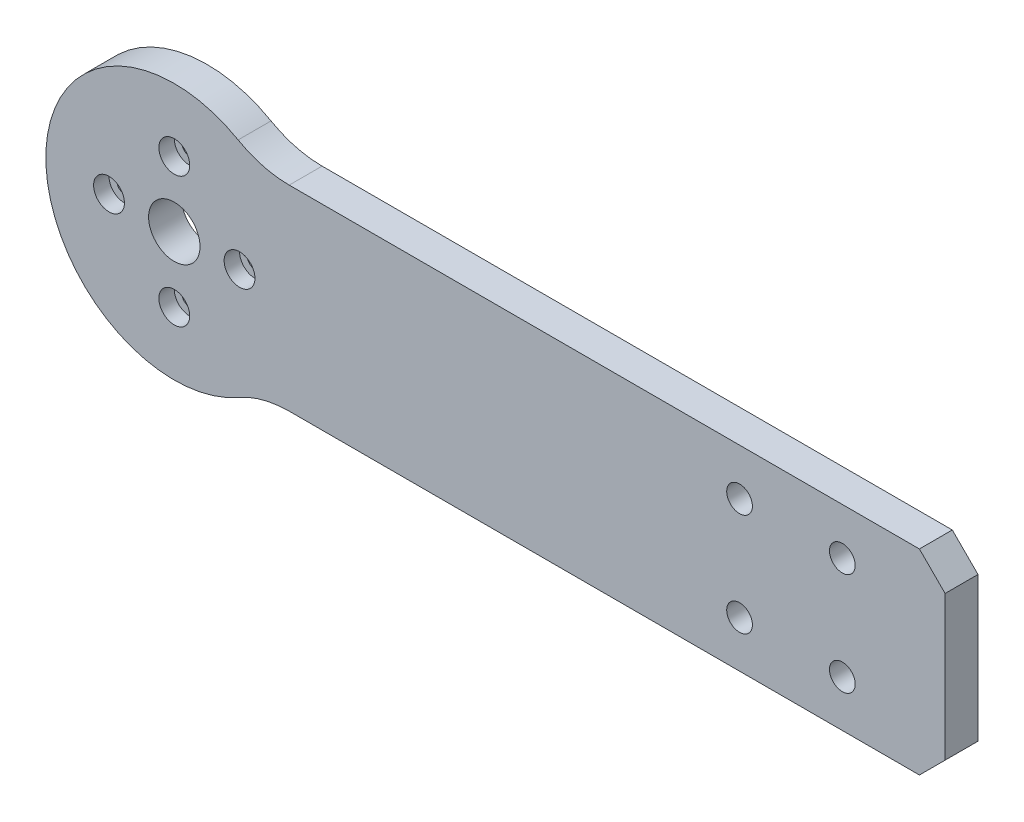
ISO-10303-21;
HEADER;
FILE_DESCRIPTION(('STEP AP214'),'2;1');
FILE_NAME('part.step','',(''),(''),'','','');
FILE_SCHEMA(('AUTOMOTIVE_DESIGN { 1 0 10303 214 1 1 1 1 }'));
ENDSEC;
DATA;
#1=APPLICATION_CONTEXT('core data for automotive mechanical design processes');
#2=APPLICATION_PROTOCOL_DEFINITION('international standard','automotive_design',2000,#1);
#3=PRODUCT_CONTEXT('',#1,'mechanical');
#4=PRODUCT('Part','Part','',(#3));
#5=PRODUCT_RELATED_PRODUCT_CATEGORY('part','',(#4));
#6=PRODUCT_DEFINITION_FORMATION('','',#4);
#7=PRODUCT_DEFINITION_CONTEXT('part definition',#1,'design');
#8=PRODUCT_DEFINITION('design','',#6,#7);
#9=PRODUCT_DEFINITION_SHAPE('','',#8);
#10=(LENGTH_UNIT() NAMED_UNIT(*) SI_UNIT(.MILLI.,.METRE.));
#11=(NAMED_UNIT(*) PLANE_ANGLE_UNIT() SI_UNIT($,.RADIAN.));
#12=(NAMED_UNIT(*) SI_UNIT($,.STERADIAN.) SOLID_ANGLE_UNIT());
#13=UNCERTAINTY_MEASURE_WITH_UNIT(LENGTH_MEASURE(1.E-05),#10,'distance_accuracy_value','');
#14=(GEOMETRIC_REPRESENTATION_CONTEXT(3) GLOBAL_UNCERTAINTY_ASSIGNED_CONTEXT((#13)) GLOBAL_UNIT_ASSIGNED_CONTEXT((#10,
#11,#12)) REPRESENTATION_CONTEXT('',''));
#15=CARTESIAN_POINT('',(0.,0.,0.));
#16=DIRECTION('',(0.,0.,1.));
#17=DIRECTION('',(1.,0.,0.));
#18=AXIS2_PLACEMENT_3D('',#15,#16,#17);
#19=CARTESIAN_POINT('',(0.,-12.7,6.4));
#20=DIRECTION('',(0.,0.,-1.));
#21=DIRECTION('',(-1.,0.,0.));
#22=AXIS2_PLACEMENT_3D('',#19,#20,#21);
#23=CYLINDRICAL_SURFACE('',#22,1.5);
#24=CARTESIAN_POINT('',(0.,-12.7,0.));
#25=DIRECTION('',(0.,0.,1.));
#26=DIRECTION('',(1.,0.,0.));
#27=AXIS2_PLACEMENT_3D('',#24,#25,#26);
#28=CIRCLE('',#27,1.5);
#29=CARTESIAN_POINT('',(1.5,-12.7,0.));
#30=VERTEX_POINT('',#29);
#31=EDGE_CURVE('E226',#30,#30,#28,.T.);
#32=ORIENTED_EDGE('',*,*,#31,.F.);
#33=EDGE_LOOP('',(#32));
#34=FACE_BOUND('',#33,.T.);
#35=CARTESIAN_POINT('',(0.,-12.7,3.4));
#36=DIRECTION('',(0.,0.,1.));
#37=DIRECTION('',(1.,0.,0.));
#38=AXIS2_PLACEMENT_3D('',#35,#36,#37);
#39=CIRCLE('',#38,1.5);
#40=CARTESIAN_POINT('',(1.5,-12.7,3.4));
#41=VERTEX_POINT('',#40);
#42=EDGE_CURVE('E166',#41,#41,#39,.T.);
#43=ORIENTED_EDGE('',*,*,#42,.T.);
#44=EDGE_LOOP('',(#43));
#45=FACE_BOUND('',#44,.T.);
#46=ADVANCED_FACE('F38',(#34,#45),#23,.F.);
#47=CARTESIAN_POINT('',(12.7,0.,6.4));
#48=DIRECTION('',(0.,0.,-1.));
#49=DIRECTION('',(-1.,0.,0.));
#50=AXIS2_PLACEMENT_3D('',#47,#48,#49);
#51=CYLINDRICAL_SURFACE('',#50,1.5);
#52=CARTESIAN_POINT('',(12.7,0.,0.));
#53=DIRECTION('',(0.,0.,1.));
#54=DIRECTION('',(1.,0.,0.));
#55=AXIS2_PLACEMENT_3D('',#52,#53,#54);
#56=CIRCLE('',#55,1.5);
#57=CARTESIAN_POINT('',(14.2,0.,0.));
#58=VERTEX_POINT('',#57);
#59=EDGE_CURVE('E209',#58,#58,#56,.T.);
#60=ORIENTED_EDGE('',*,*,#59,.F.);
#61=EDGE_LOOP('',(#60));
#62=FACE_BOUND('',#61,.T.);
#63=CARTESIAN_POINT('',(12.7,0.,3.4));
#64=DIRECTION('',(0.,0.,1.));
#65=DIRECTION('',(1.,0.,0.));
#66=AXIS2_PLACEMENT_3D('',#63,#64,#65);
#67=CIRCLE('',#66,1.5);
#68=CARTESIAN_POINT('',(14.2,0.,3.4));
#69=VERTEX_POINT('',#68);
#70=EDGE_CURVE('E162',#69,#69,#67,.T.);
#71=ORIENTED_EDGE('',*,*,#70,.T.);
#72=EDGE_LOOP('',(#71));
#73=FACE_BOUND('',#72,.T.);
#74=ADVANCED_FACE('F327',(#62,#73),#51,.F.);
#75=CARTESIAN_POINT('',(0.,12.7,6.4));
#76=DIRECTION('',(0.,0.,-1.));
#77=DIRECTION('',(-1.,0.,0.));
#78=AXIS2_PLACEMENT_3D('',#75,#76,#77);
#79=CYLINDRICAL_SURFACE('',#78,1.5);
#80=CARTESIAN_POINT('',(0.,12.7,0.));
#81=DIRECTION('',(0.,0.,1.));
#82=DIRECTION('',(1.,0.,0.));
#83=AXIS2_PLACEMENT_3D('',#80,#81,#82);
#84=CIRCLE('',#83,1.5);
#85=CARTESIAN_POINT('',(1.5,12.7,0.));
#86=VERTEX_POINT('',#85);
#87=EDGE_CURVE('E207',#86,#86,#84,.T.);
#88=ORIENTED_EDGE('',*,*,#87,.F.);
#89=EDGE_LOOP('',(#88));
#90=FACE_BOUND('',#89,.T.);
#91=CARTESIAN_POINT('',(0.,12.7,3.4));
#92=DIRECTION('',(0.,0.,1.));
#93=DIRECTION('',(1.,0.,0.));
#94=AXIS2_PLACEMENT_3D('',#91,#92,#93);
#95=CIRCLE('',#94,1.5);
#96=CARTESIAN_POINT('',(1.5,12.7,3.4));
#97=VERTEX_POINT('',#96);
#98=EDGE_CURVE('E157',#97,#97,#95,.T.);
#99=ORIENTED_EDGE('',*,*,#98,.T.);
#100=EDGE_LOOP('',(#99));
#101=FACE_BOUND('',#100,.T.);
#102=ADVANCED_FACE('F333',(#90,#101),#79,.F.);
#103=CARTESIAN_POINT('',(-12.7,0.,6.4));
#104=DIRECTION('',(0.,0.,-1.));
#105=DIRECTION('',(-1.,0.,0.));
#106=AXIS2_PLACEMENT_3D('',#103,#104,#105);
#107=CYLINDRICAL_SURFACE('',#106,1.5);
#108=CARTESIAN_POINT('',(-12.7,0.,0.));
#109=DIRECTION('',(0.,0.,1.));
#110=DIRECTION('',(1.,0.,0.));
#111=AXIS2_PLACEMENT_3D('',#108,#109,#110);
#112=CIRCLE('',#111,1.5);
#113=CARTESIAN_POINT('',(-11.2,0.,0.));
#114=VERTEX_POINT('',#113);
#115=EDGE_CURVE('E170',#114,#114,#112,.T.);
#116=ORIENTED_EDGE('',*,*,#115,.F.);
#117=EDGE_LOOP('',(#116));
#118=FACE_BOUND('',#117,.T.);
#119=CARTESIAN_POINT('',(-12.7,0.,3.4));
#120=DIRECTION('',(0.,0.,1.));
#121=DIRECTION('',(1.,0.,0.));
#122=AXIS2_PLACEMENT_3D('',#119,#120,#121);
#123=CIRCLE('',#122,1.5);
#124=CARTESIAN_POINT('',(-11.2,0.,3.4));
#125=VERTEX_POINT('',#124);
#126=EDGE_CURVE('E153',#125,#125,#123,.T.);
#127=ORIENTED_EDGE('',*,*,#126,.T.);
#128=EDGE_LOOP('',(#127));
#129=FACE_BOUND('',#128,.T.);
#130=ADVANCED_FACE('F363',(#118,#129),#107,.F.);
#131=CARTESIAN_POINT('',(0.,0.,6.4));
#132=DIRECTION('',(0.,0.,1.));
#133=DIRECTION('',(1.,0.,0.));
#134=AXIS2_PLACEMENT_3D('',#131,#132,#133);
#135=PLANE('',#134);
#136=CARTESIAN_POINT('',(0.,12.7,6.4));
#137=DIRECTION('',(0.,0.,1.));
#138=DIRECTION('',(1.,0.,0.));
#139=AXIS2_PLACEMENT_3D('',#136,#137,#138);
#140=CIRCLE('',#139,3.);
#141=CARTESIAN_POINT('',(3.,12.7,6.4));
#142=VERTEX_POINT('',#141);
#143=EDGE_CURVE('E217',#142,#142,#140,.T.);
#144=ORIENTED_EDGE('',*,*,#143,.F.);
#145=EDGE_LOOP('',(#144));
#146=FACE_BOUND('',#145,.T.);
#147=CARTESIAN_POINT('',(12.7000000000001,0.,6.4));
#148=DIRECTION('',(0.,0.,1.));
#149=DIRECTION('',(1.,0.,0.));
#150=AXIS2_PLACEMENT_3D('',#147,#148,#149);
#151=CIRCLE('',#150,2.99999999999993);
#152=CARTESIAN_POINT('',(15.7,0.,6.4));
#153=VERTEX_POINT('',#152);
#154=EDGE_CURVE('E218',#153,#153,#151,.T.);
#155=ORIENTED_EDGE('',*,*,#154,.F.);
#156=EDGE_LOOP('',(#155));
#157=FACE_BOUND('',#156,.T.);
#158=CARTESIAN_POINT('',(0.,-12.7000000000002,6.4));
#159=DIRECTION('',(0.,0.,1.));
#160=DIRECTION('',(1.,0.,0.));
#161=AXIS2_PLACEMENT_3D('',#158,#159,#160);
#162=CIRCLE('',#161,3.00000000000003);
#163=CARTESIAN_POINT('',(3.00000000000004,-12.7000000000002,6.4));
#164=VERTEX_POINT('',#163);
#165=EDGE_CURVE('E252',#164,#164,#162,.T.);
#166=ORIENTED_EDGE('',*,*,#165,.F.);
#167=EDGE_LOOP('',(#166));
#168=FACE_BOUND('',#167,.T.);
#169=CARTESIAN_POINT('',(-12.7000000000001,0.,6.4));
#170=DIRECTION('',(0.,0.,1.));
#171=DIRECTION('',(1.,0.,0.));
#172=AXIS2_PLACEMENT_3D('',#169,#170,#171);
#173=CIRCLE('',#172,3.00000000000019);
#174=CARTESIAN_POINT('',(-9.6999999999999,0.,6.4));
#175=VERTEX_POINT('',#174);
#176=EDGE_CURVE('E278',#175,#175,#173,.T.);
#177=ORIENTED_EDGE('',*,*,#176,.F.);
#178=EDGE_LOOP('',(#177));
#179=FACE_BOUND('',#178,.T.);
#180=CARTESIAN_POINT('',(110.,-10.,6.4));
#181=DIRECTION('',(0.,0.,1.));
#182=DIRECTION('',(1.,0.,0.));
#183=AXIS2_PLACEMENT_3D('',#180,#181,#182);
#184=CIRCLE('',#183,2.49999999999999);
#185=CARTESIAN_POINT('',(112.5,-10.,6.4));
#186=VERTEX_POINT('',#185);
#187=EDGE_CURVE('E222',#186,#186,#184,.T.);
#188=ORIENTED_EDGE('',*,*,#187,.F.);
#189=EDGE_LOOP('',(#188));
#190=FACE_BOUND('',#189,.T.);
#191=CARTESIAN_POINT('',(130.,10.,6.4));
#192=DIRECTION('',(0.,0.,1.));
#193=DIRECTION('',(1.,0.,0.));
#194=AXIS2_PLACEMENT_3D('',#191,#192,#193);
#195=CIRCLE('',#194,2.5);
#196=CARTESIAN_POINT('',(132.5,10.,6.4));
#197=VERTEX_POINT('',#196);
#198=EDGE_CURVE('E256',#197,#197,#195,.T.);
#199=ORIENTED_EDGE('',*,*,#198,.F.);
#200=EDGE_LOOP('',(#199));
#201=FACE_BOUND('',#200,.T.);
#202=CARTESIAN_POINT('',(0.,0.,6.4));
#203=DIRECTION('',(0.,0.,1.));
#204=DIRECTION('',(1.,0.,0.));
#205=AXIS2_PLACEMENT_3D('',#202,#203,#204);
#206=CIRCLE('',#205,25.);
#207=CARTESIAN_POINT('',(12.4238110194462,21.6944444444445,6.4));
#208=VERTEX_POINT('',#207);
#209=CARTESIAN_POINT('',(12.4238110194462,-21.6944444444445,6.4));
#210=VERTEX_POINT('',#209);
#211=EDGE_CURVE('E212',#208,#210,#206,.T.);
#212=ORIENTED_EDGE('',*,*,#211,.T.);
#213=CARTESIAN_POINT('',(22.3628598350032,-39.05,6.4));
#214=DIRECTION('',(0.,0.,1.));
#215=DIRECTION('',(1.,0.,0.));
#216=AXIS2_PLACEMENT_3D('',#213,#214,#215);
#217=CIRCLE('',#216,20.);
#218=CARTESIAN_POINT('',(22.3628598350032,-19.05,6.4));
#219=VERTEX_POINT('',#218);
#220=EDGE_CURVE('E203',#210,#219,#217,.F.);
#221=ORIENTED_EDGE('',*,*,#220,.T.);
#222=DIRECTION('',(1.,0.,0.));
#223=VECTOR('',#222,1.);
#224=CARTESIAN_POINT('',(150.,-19.05,6.4));
#225=LINE('',#224,#223);
#226=CARTESIAN_POINT('',(145.,-19.05,6.4));
#227=VERTEX_POINT('',#226);
#228=EDGE_CURVE('E144',#219,#227,#225,.T.);
#229=ORIENTED_EDGE('',*,*,#228,.T.);
#230=DIRECTION('',(-0.707106781186549,-0.707106781186546,0.));
#231=VECTOR('',#230,1.);
#232=CARTESIAN_POINT('',(82.0249999999996,-82.025,6.4));
#233=LINE('',#232,#231);
#234=CARTESIAN_POINT('',(150.,-14.05,6.4));
#235=VERTEX_POINT('',#234);
#236=EDGE_CURVE('E180',#227,#235,#233,.F.);
#237=ORIENTED_EDGE('',*,*,#236,.T.);
#238=DIRECTION('',(0.,1.,0.));
#239=VECTOR('',#238,1.);
#240=CARTESIAN_POINT('',(150.,19.05,6.4));
#241=LINE('',#240,#239);
#242=CARTESIAN_POINT('',(150.,14.05,6.4));
#243=VERTEX_POINT('',#242);
#244=EDGE_CURVE('E124',#235,#243,#241,.T.);
#245=ORIENTED_EDGE('',*,*,#244,.T.);
#246=DIRECTION('',(0.707106781186546,-0.707106781186549,0.));
#247=VECTOR('',#246,1.);
#248=CARTESIAN_POINT('',(82.0250000000004,82.0249999999999,6.4));
#249=LINE('',#248,#247);
#250=CARTESIAN_POINT('',(145.,19.05,6.4));
#251=VERTEX_POINT('',#250);
#252=EDGE_CURVE('E177',#243,#251,#249,.F.);
#253=ORIENTED_EDGE('',*,*,#252,.T.);
#254=DIRECTION('',(-1.,0.,0.));
#255=VECTOR('',#254,1.);
#256=CARTESIAN_POINT('',(150.,19.05,6.4));
#257=LINE('',#256,#255);
#258=CARTESIAN_POINT('',(22.3628598350032,19.05,6.4));
#259=VERTEX_POINT('',#258);
#260=EDGE_CURVE('E236',#251,#259,#257,.T.);
#261=ORIENTED_EDGE('',*,*,#260,.T.);
#262=CARTESIAN_POINT('',(22.3628598350032,39.05,6.4));
#263=DIRECTION('',(0.,0.,1.));
#264=DIRECTION('',(1.,0.,0.));
#265=AXIS2_PLACEMENT_3D('',#262,#263,#264);
#266=CIRCLE('',#265,20.);
#267=EDGE_CURVE('E11',#259,#208,#266,.F.);
#268=ORIENTED_EDGE('',*,*,#267,.T.);
#269=EDGE_LOOP('',(#212,#221,#229,#237,#245,#253,#261,#268));
#270=FACE_BOUND('',#269,.T.);
#271=CARTESIAN_POINT('',(0.,0.,6.4));
#272=DIRECTION('',(0.,0.,1.));
#273=DIRECTION('',(1.,0.,0.));
#274=AXIS2_PLACEMENT_3D('',#271,#272,#273);
#275=CIRCLE('',#274,5.);
#276=CARTESIAN_POINT('',(5.,0.,6.4));
#277=VERTEX_POINT('',#276);
#278=EDGE_CURVE('E132',#277,#277,#275,.T.);
#279=ORIENTED_EDGE('',*,*,#278,.F.);
#280=EDGE_LOOP('',(#279));
#281=FACE_BOUND('',#280,.T.);
#282=CARTESIAN_POINT('',(110.,10.,6.4));
#283=DIRECTION('',(0.,0.,1.));
#284=DIRECTION('',(1.,0.,0.));
#285=AXIS2_PLACEMENT_3D('',#282,#283,#284);
#286=CIRCLE('',#285,2.49999999999999);
#287=CARTESIAN_POINT('',(112.5,10.,6.4));
#288=VERTEX_POINT('',#287);
#289=EDGE_CURVE('E285',#288,#288,#286,.T.);
#290=ORIENTED_EDGE('',*,*,#289,.F.);
#291=EDGE_LOOP('',(#290));
#292=FACE_BOUND('',#291,.T.);
#293=CARTESIAN_POINT('',(130.,-10.,6.4));
#294=DIRECTION('',(0.,0.,1.));
#295=DIRECTION('',(1.,0.,0.));
#296=AXIS2_PLACEMENT_3D('',#293,#294,#295);
#297=CIRCLE('',#296,2.5);
#298=CARTESIAN_POINT('',(132.5,-10.,6.4));
#299=VERTEX_POINT('',#298);
#300=EDGE_CURVE('E223',#299,#299,#297,.T.);
#301=ORIENTED_EDGE('',*,*,#300,.F.);
#302=EDGE_LOOP('',(#301));
#303=FACE_BOUND('',#302,.T.);
#304=ADVANCED_FACE('F298',(#146,#157,#168,#179,#190,#201,#270,#281,#292,#303),#135,.T.);
#305=CARTESIAN_POINT('',(0.,0.,0.));
#306=DIRECTION('',(0.,0.,1.));
#307=DIRECTION('',(1.,0.,0.));
#308=AXIS2_PLACEMENT_3D('',#305,#306,#307);
#309=PLANE('',#308);
#310=DIRECTION('',(0.,1.,0.));
#311=VECTOR('',#310,1.);
#312=CARTESIAN_POINT('',(150.,19.05,0.));
#313=LINE('',#312,#311);
#314=CARTESIAN_POINT('',(150.,-14.05,0.));
#315=VERTEX_POINT('',#314);
#316=CARTESIAN_POINT('',(150.,14.05,0.));
#317=VERTEX_POINT('',#316);
#318=EDGE_CURVE('E121',#315,#317,#313,.T.);
#319=ORIENTED_EDGE('',*,*,#318,.F.);
#320=DIRECTION('',(0.707106781186549,0.707106781186546,0.));
#321=VECTOR('',#320,1.);
#322=CARTESIAN_POINT('',(150.,-14.05,0.));
#323=LINE('',#322,#321);
#324=CARTESIAN_POINT('',(145.,-19.05,0.));
#325=VERTEX_POINT('',#324);
#326=EDGE_CURVE('E105',#315,#325,#323,.F.);
#327=ORIENTED_EDGE('',*,*,#326,.T.);
#328=DIRECTION('',(1.,0.,0.));
#329=VECTOR('',#328,1.);
#330=CARTESIAN_POINT('',(150.,-19.05,0.));
#331=LINE('',#330,#329);
#332=CARTESIAN_POINT('',(22.3628598350032,-19.05,0.));
#333=VERTEX_POINT('',#332);
#334=EDGE_CURVE('E150',#333,#325,#331,.T.);
#335=ORIENTED_EDGE('',*,*,#334,.F.);
#336=CARTESIAN_POINT('',(22.3628598350032,-39.05,0.));
#337=DIRECTION('',(0.,0.,1.));
#338=DIRECTION('',(1.,0.,0.));
#339=AXIS2_PLACEMENT_3D('',#336,#337,#338);
#340=CIRCLE('',#339,20.);
#341=CARTESIAN_POINT('',(12.4238110194462,-21.6944444444445,0.));
#342=VERTEX_POINT('',#341);
#343=EDGE_CURVE('E200',#333,#342,#340,.T.);
#344=ORIENTED_EDGE('',*,*,#343,.T.);
#345=CARTESIAN_POINT('',(0.,0.,0.));
#346=DIRECTION('',(0.,0.,1.));
#347=DIRECTION('',(1.,0.,0.));
#348=AXIS2_PLACEMENT_3D('',#345,#346,#347);
#349=CIRCLE('',#348,25.);
#350=CARTESIAN_POINT('',(12.4238110194462,21.6944444444445,0.));
#351=VERTEX_POINT('',#350);
#352=EDGE_CURVE('E137',#351,#342,#349,.T.);
#353=ORIENTED_EDGE('',*,*,#352,.F.);
#354=CARTESIAN_POINT('',(22.3628598350032,39.05,0.));
#355=DIRECTION('',(0.,0.,1.));
#356=DIRECTION('',(1.,0.,0.));
#357=AXIS2_PLACEMENT_3D('',#354,#355,#356);
#358=CIRCLE('',#357,20.);
#359=CARTESIAN_POINT('',(22.3628598350032,19.05,0.));
#360=VERTEX_POINT('',#359);
#361=EDGE_CURVE('E47',#351,#360,#358,.T.);
#362=ORIENTED_EDGE('',*,*,#361,.T.);
#363=DIRECTION('',(-1.,0.,0.));
#364=VECTOR('',#363,1.);
#365=CARTESIAN_POINT('',(150.,19.05,0.));
#366=LINE('',#365,#364);
#367=CARTESIAN_POINT('',(145.,19.05,0.));
#368=VERTEX_POINT('',#367);
#369=EDGE_CURVE('E131',#368,#360,#366,.T.);
#370=ORIENTED_EDGE('',*,*,#369,.F.);
#371=DIRECTION('',(-0.707106781186546,0.707106781186549,0.));
#372=VECTOR('',#371,1.);
#373=CARTESIAN_POINT('',(145.,19.05,0.));
#374=LINE('',#373,#372);
#375=EDGE_CURVE('E115',#368,#317,#374,.F.);
#376=ORIENTED_EDGE('',*,*,#375,.T.);
#377=EDGE_LOOP('',(#319,#327,#335,#344,#353,#362,#370,#376));
#378=FACE_BOUND('',#377,.T.);
#379=CARTESIAN_POINT('',(0.,0.,0.));
#380=DIRECTION('',(0.,0.,1.));
#381=DIRECTION('',(1.,0.,0.));
#382=AXIS2_PLACEMENT_3D('',#379,#380,#381);
#383=CIRCLE('',#382,5.);
#384=CARTESIAN_POINT('',(5.,0.,0.));
#385=VERTEX_POINT('',#384);
#386=EDGE_CURVE('E141',#385,#385,#383,.T.);
#387=ORIENTED_EDGE('',*,*,#386,.T.);
#388=EDGE_LOOP('',(#387));
#389=FACE_BOUND('',#388,.T.);
#390=CARTESIAN_POINT('',(130.,10.,0.));
#391=DIRECTION('',(0.,0.,1.));
#392=DIRECTION('',(1.,0.,0.));
#393=AXIS2_PLACEMENT_3D('',#390,#391,#392);
#394=CIRCLE('',#393,2.5);
#395=CARTESIAN_POINT('',(132.5,10.,0.));
#396=VERTEX_POINT('',#395);
#397=EDGE_CURVE('E259',#396,#396,#394,.T.);
#398=ORIENTED_EDGE('',*,*,#397,.T.);
#399=EDGE_LOOP('',(#398));
#400=FACE_BOUND('',#399,.T.);
#401=CARTESIAN_POINT('',(110.,10.,0.));
#402=DIRECTION('',(0.,0.,1.));
#403=DIRECTION('',(1.,0.,0.));
#404=AXIS2_PLACEMENT_3D('',#401,#402,#403);
#405=CIRCLE('',#404,2.49999999999999);
#406=CARTESIAN_POINT('',(112.5,10.,0.));
#407=VERTEX_POINT('',#406);
#408=EDGE_CURVE('E283',#407,#407,#405,.T.);
#409=ORIENTED_EDGE('',*,*,#408,.T.);
#410=EDGE_LOOP('',(#409));
#411=FACE_BOUND('',#410,.T.);
#412=CARTESIAN_POINT('',(110.,-10.,0.));
#413=DIRECTION('',(0.,0.,1.));
#414=DIRECTION('',(1.,0.,0.));
#415=AXIS2_PLACEMENT_3D('',#412,#413,#414);
#416=CIRCLE('',#415,2.49999999999999);
#417=CARTESIAN_POINT('',(112.5,-10.,0.));
#418=VERTEX_POINT('',#417);
#419=EDGE_CURVE('E220',#418,#418,#416,.T.);
#420=ORIENTED_EDGE('',*,*,#419,.T.);
#421=EDGE_LOOP('',(#420));
#422=FACE_BOUND('',#421,.T.);
#423=CARTESIAN_POINT('',(130.,-10.,0.));
#424=DIRECTION('',(0.,0.,1.));
#425=DIRECTION('',(1.,0.,0.));
#426=AXIS2_PLACEMENT_3D('',#423,#424,#425);
#427=CIRCLE('',#426,2.5);
#428=CARTESIAN_POINT('',(132.5,-10.,0.));
#429=VERTEX_POINT('',#428);
#430=EDGE_CURVE('E229',#429,#429,#427,.T.);
#431=ORIENTED_EDGE('',*,*,#430,.T.);
#432=EDGE_LOOP('',(#431));
#433=FACE_BOUND('',#432,.T.);
#434=ORIENTED_EDGE('',*,*,#31,.T.);
#435=EDGE_LOOP('',(#434));
#436=FACE_BOUND('',#435,.T.);
#437=ORIENTED_EDGE('',*,*,#59,.T.);
#438=EDGE_LOOP('',(#437));
#439=FACE_BOUND('',#438,.T.);
#440=ORIENTED_EDGE('',*,*,#87,.T.);
#441=EDGE_LOOP('',(#440));
#442=FACE_BOUND('',#441,.T.);
#443=ORIENTED_EDGE('',*,*,#115,.T.);
#444=EDGE_LOOP('',(#443));
#445=FACE_BOUND('',#444,.T.);
#446=ADVANCED_FACE('F128',(#378,#389,#400,#411,#422,#433,#436,#439,#442,#445),#309,.F.);
#447=CARTESIAN_POINT('',(150.,19.05,6.4));
#448=DIRECTION('',(-1.,0.,0.));
#449=DIRECTION('',(0.,0.,1.));
#450=AXIS2_PLACEMENT_3D('',#447,#448,#449);
#451=PLANE('',#450);
#452=ORIENTED_EDGE('',*,*,#244,.F.);
#453=DIRECTION('',(0.,0.,-1.));
#454=VECTOR('',#453,1.);
#455=CARTESIAN_POINT('',(150.,-14.05,6.4));
#456=LINE('',#455,#454);
#457=EDGE_CURVE('E109',#235,#315,#456,.T.);
#458=ORIENTED_EDGE('',*,*,#457,.T.);
#459=ORIENTED_EDGE('',*,*,#318,.T.);
#460=DIRECTION('',(0.,0.,1.));
#461=VECTOR('',#460,1.);
#462=CARTESIAN_POINT('',(150.,14.05,6.4));
#463=LINE('',#462,#461);
#464=EDGE_CURVE('E126',#317,#243,#463,.T.);
#465=ORIENTED_EDGE('',*,*,#464,.T.);
#466=EDGE_LOOP('',(#452,#458,#459,#465));
#467=FACE_BOUND('',#466,.T.);
#468=ADVANCED_FACE('F120',(#467),#451,.F.);
#469=CARTESIAN_POINT('',(150.,19.05,6.4));
#470=DIRECTION('',(0.,-1.,0.));
#471=DIRECTION('',(1.,0.,0.));
#472=AXIS2_PLACEMENT_3D('',#469,#470,#471);
#473=PLANE('',#472);
#474=ORIENTED_EDGE('',*,*,#369,.T.);
#475=DIRECTION('',(0.,0.,1.));
#476=VECTOR('',#475,1.);
#477=CARTESIAN_POINT('',(22.3628598350032,19.05,6.4));
#478=LINE('',#477,#476);
#479=EDGE_CURVE('E60',#360,#259,#478,.T.);
#480=ORIENTED_EDGE('',*,*,#479,.T.);
#481=ORIENTED_EDGE('',*,*,#260,.F.);
#482=DIRECTION('',(0.,0.,-1.));
#483=VECTOR('',#482,1.);
#484=CARTESIAN_POINT('',(145.,19.05,6.4));
#485=LINE('',#484,#483);
#486=EDGE_CURVE('E183',#251,#368,#485,.T.);
#487=ORIENTED_EDGE('',*,*,#486,.T.);
#488=EDGE_LOOP('',(#474,#480,#481,#487));
#489=FACE_BOUND('',#488,.T.);
#490=ADVANCED_FACE('F317',(#489),#473,.F.);
#491=CARTESIAN_POINT('',(0.,0.,6.4));
#492=DIRECTION('',(0.,0.,-1.));
#493=DIRECTION('',(-1.,0.,0.));
#494=AXIS2_PLACEMENT_3D('',#491,#492,#493);
#495=CYLINDRICAL_SURFACE('',#494,25.);
#496=ORIENTED_EDGE('',*,*,#352,.T.);
#497=DIRECTION('',(0.,0.,-1.));
#498=VECTOR('',#497,1.);
#499=CARTESIAN_POINT('',(12.4238110194462,-21.6944444444445,6.4));
#500=LINE('',#499,#498);
#501=EDGE_CURVE('E195',#342,#210,#500,.F.);
#502=ORIENTED_EDGE('',*,*,#501,.T.);
#503=ORIENTED_EDGE('',*,*,#211,.F.);
#504=DIRECTION('',(0.,0.,-1.));
#505=VECTOR('',#504,1.);
#506=CARTESIAN_POINT('',(12.4238110194462,21.6944444444445,6.4));
#507=LINE('',#506,#505);
#508=EDGE_CURVE('E191',#208,#351,#507,.T.);
#509=ORIENTED_EDGE('',*,*,#508,.T.);
#510=EDGE_LOOP('',(#496,#502,#503,#509));
#511=FACE_BOUND('',#510,.T.);
#512=ADVANCED_FACE('F306',(#511),#495,.T.);
#513=CARTESIAN_POINT('',(150.,-19.05,6.4));
#514=DIRECTION('',(0.,1.,0.));
#515=DIRECTION('',(-1.,0.,0.));
#516=AXIS2_PLACEMENT_3D('',#513,#514,#515);
#517=PLANE('',#516);
#518=ORIENTED_EDGE('',*,*,#228,.F.);
#519=DIRECTION('',(0.,0.,1.));
#520=VECTOR('',#519,1.);
#521=CARTESIAN_POINT('',(22.3628598350032,-19.05,0.));
#522=LINE('',#521,#520);
#523=EDGE_CURVE('E187',#219,#333,#522,.F.);
#524=ORIENTED_EDGE('',*,*,#523,.T.);
#525=ORIENTED_EDGE('',*,*,#334,.T.);
#526=DIRECTION('',(0.,0.,1.));
#527=VECTOR('',#526,1.);
#528=CARTESIAN_POINT('',(145.,-19.05,6.4));
#529=LINE('',#528,#527);
#530=EDGE_CURVE('E111',#325,#227,#529,.T.);
#531=ORIENTED_EDGE('',*,*,#530,.T.);
#532=EDGE_LOOP('',(#518,#524,#525,#531));
#533=FACE_BOUND('',#532,.T.);
#534=ADVANCED_FACE('F314',(#533),#517,.F.);
#535=CARTESIAN_POINT('',(0.,0.,6.4));
#536=DIRECTION('',(0.,0.,-1.));
#537=DIRECTION('',(-1.,0.,0.));
#538=AXIS2_PLACEMENT_3D('',#535,#536,#537);
#539=CYLINDRICAL_SURFACE('',#538,5.);
#540=ORIENTED_EDGE('',*,*,#278,.T.);
#541=EDGE_LOOP('',(#540));
#542=FACE_BOUND('',#541,.T.);
#543=ORIENTED_EDGE('',*,*,#386,.F.);
#544=EDGE_LOOP('',(#543));
#545=FACE_BOUND('',#544,.T.);
#546=ADVANCED_FACE('F356',(#542,#545),#539,.F.);
#547=CARTESIAN_POINT('',(130.,10.,6.4));
#548=DIRECTION('',(0.,0.,-1.));
#549=DIRECTION('',(-1.,0.,0.));
#550=AXIS2_PLACEMENT_3D('',#547,#548,#549);
#551=CYLINDRICAL_SURFACE('',#550,2.5);
#552=ORIENTED_EDGE('',*,*,#198,.T.);
#553=EDGE_LOOP('',(#552));
#554=FACE_BOUND('',#553,.T.);
#555=ORIENTED_EDGE('',*,*,#397,.F.);
#556=EDGE_LOOP('',(#555));
#557=FACE_BOUND('',#556,.T.);
#558=ADVANCED_FACE('F352',(#554,#557),#551,.F.);
#559=CARTESIAN_POINT('',(110.,10.,6.4));
#560=DIRECTION('',(0.,0.,-1.));
#561=DIRECTION('',(-1.,0.,0.));
#562=AXIS2_PLACEMENT_3D('',#559,#560,#561);
#563=CYLINDRICAL_SURFACE('',#562,2.49999999999999);
#564=ORIENTED_EDGE('',*,*,#289,.T.);
#565=EDGE_LOOP('',(#564));
#566=FACE_BOUND('',#565,.T.);
#567=ORIENTED_EDGE('',*,*,#408,.F.);
#568=EDGE_LOOP('',(#567));
#569=FACE_BOUND('',#568,.T.);
#570=ADVANCED_FACE('F348',(#566,#569),#563,.F.);
#571=CARTESIAN_POINT('',(110.,-10.,6.4));
#572=DIRECTION('',(0.,0.,-1.));
#573=DIRECTION('',(-1.,0.,0.));
#574=AXIS2_PLACEMENT_3D('',#571,#572,#573);
#575=CYLINDRICAL_SURFACE('',#574,2.49999999999999);
#576=ORIENTED_EDGE('',*,*,#187,.T.);
#577=EDGE_LOOP('',(#576));
#578=FACE_BOUND('',#577,.T.);
#579=ORIENTED_EDGE('',*,*,#419,.F.);
#580=EDGE_LOOP('',(#579));
#581=FACE_BOUND('',#580,.T.);
#582=ADVANCED_FACE('F344',(#578,#581),#575,.F.);
#583=CARTESIAN_POINT('',(130.,-10.,6.4));
#584=DIRECTION('',(0.,0.,-1.));
#585=DIRECTION('',(-1.,0.,0.));
#586=AXIS2_PLACEMENT_3D('',#583,#584,#585);
#587=CYLINDRICAL_SURFACE('',#586,2.5);
#588=ORIENTED_EDGE('',*,*,#300,.T.);
#589=EDGE_LOOP('',(#588));
#590=FACE_BOUND('',#589,.T.);
#591=ORIENTED_EDGE('',*,*,#430,.F.);
#592=EDGE_LOOP('',(#591));
#593=FACE_BOUND('',#592,.T.);
#594=ADVANCED_FACE('F340',(#590,#593),#587,.F.);
#595=CARTESIAN_POINT('',(-12.7000000000001,0.,3.4));
#596=DIRECTION('',(0.,0.,1.));
#597=DIRECTION('',(1.,0.,0.));
#598=AXIS2_PLACEMENT_3D('',#595,#596,#597);
#599=CYLINDRICAL_SURFACE('',#598,3.00000000000019);
#600=CARTESIAN_POINT('',(-12.7000000000001,0.,3.4));
#601=DIRECTION('',(0.,0.,1.));
#602=DIRECTION('',(1.,0.,0.));
#603=AXIS2_PLACEMENT_3D('',#600,#601,#602);
#604=CIRCLE('',#603,3.00000000000019);
#605=CARTESIAN_POINT('',(-9.6999999999999,0.,3.4));
#606=VERTEX_POINT('',#605);
#607=EDGE_CURVE('E274',#606,#606,#604,.T.);
#608=ORIENTED_EDGE('',*,*,#607,.F.);
#609=EDGE_LOOP('',(#608));
#610=FACE_BOUND('',#609,.T.);
#611=ORIENTED_EDGE('',*,*,#176,.T.);
#612=EDGE_LOOP('',(#611));
#613=FACE_BOUND('',#612,.T.);
#614=ADVANCED_FACE('F343',(#610,#613),#599,.F.);
#615=CARTESIAN_POINT('',(-12.7000000000001,0.,3.4));
#616=DIRECTION('',(0.,0.,1.));
#617=DIRECTION('',(1.,0.,0.));
#618=AXIS2_PLACEMENT_3D('',#615,#616,#617);
#619=PLANE('',#618);
#620=ORIENTED_EDGE('',*,*,#126,.F.);
#621=EDGE_LOOP('',(#620));
#622=FACE_BOUND('',#621,.T.);
#623=ORIENTED_EDGE('',*,*,#607,.T.);
#624=EDGE_LOOP('',(#623));
#625=FACE_BOUND('',#624,.T.);
#626=ADVANCED_FACE('F392',(#622,#625),#619,.T.);
#627=CARTESIAN_POINT('',(0.,12.7,3.4));
#628=DIRECTION('',(0.,0.,1.));
#629=DIRECTION('',(1.,0.,0.));
#630=AXIS2_PLACEMENT_3D('',#627,#628,#629);
#631=CYLINDRICAL_SURFACE('',#630,3.);
#632=CARTESIAN_POINT('',(0.,12.7,3.4));
#633=DIRECTION('',(0.,0.,1.));
#634=DIRECTION('',(1.,0.,0.));
#635=AXIS2_PLACEMENT_3D('',#632,#633,#634);
#636=CIRCLE('',#635,3.);
#637=CARTESIAN_POINT('',(3.,12.7,3.4));
#638=VERTEX_POINT('',#637);
#639=EDGE_CURVE('E158',#638,#638,#636,.T.);
#640=ORIENTED_EDGE('',*,*,#639,.F.);
#641=EDGE_LOOP('',(#640));
#642=FACE_BOUND('',#641,.T.);
#643=ORIENTED_EDGE('',*,*,#143,.T.);
#644=EDGE_LOOP('',(#643));
#645=FACE_BOUND('',#644,.T.);
#646=ADVANCED_FACE('F399',(#642,#645),#631,.F.);
#647=CARTESIAN_POINT('',(0.,12.7,3.4));
#648=DIRECTION('',(0.,0.,1.));
#649=DIRECTION('',(1.,0.,0.));
#650=AXIS2_PLACEMENT_3D('',#647,#648,#649);
#651=PLANE('',#650);
#652=ORIENTED_EDGE('',*,*,#98,.F.);
#653=EDGE_LOOP('',(#652));
#654=FACE_BOUND('',#653,.T.);
#655=ORIENTED_EDGE('',*,*,#639,.T.);
#656=EDGE_LOOP('',(#655));
#657=FACE_BOUND('',#656,.T.);
#658=ADVANCED_FACE('F406',(#654,#657),#651,.T.);
#659=CARTESIAN_POINT('',(12.7000000000001,0.,3.4));
#660=DIRECTION('',(0.,0.,1.));
#661=DIRECTION('',(1.,0.,0.));
#662=AXIS2_PLACEMENT_3D('',#659,#660,#661);
#663=CYLINDRICAL_SURFACE('',#662,2.99999999999993);
#664=CARTESIAN_POINT('',(12.7000000000001,0.,3.4));
#665=DIRECTION('',(0.,0.,1.));
#666=DIRECTION('',(1.,0.,0.));
#667=AXIS2_PLACEMENT_3D('',#664,#665,#666);
#668=CIRCLE('',#667,2.99999999999993);
#669=CARTESIAN_POINT('',(15.7,0.,3.4));
#670=VERTEX_POINT('',#669);
#671=EDGE_CURVE('E214',#670,#670,#668,.T.);
#672=ORIENTED_EDGE('',*,*,#671,.F.);
#673=EDGE_LOOP('',(#672));
#674=FACE_BOUND('',#673,.T.);
#675=ORIENTED_EDGE('',*,*,#154,.T.);
#676=EDGE_LOOP('',(#675));
#677=FACE_BOUND('',#676,.T.);
#678=ADVANCED_FACE('F413',(#674,#677),#663,.F.);
#679=CARTESIAN_POINT('',(12.7000000000001,0.,3.4));
#680=DIRECTION('',(0.,0.,1.));
#681=DIRECTION('',(1.,0.,0.));
#682=AXIS2_PLACEMENT_3D('',#679,#680,#681);
#683=PLANE('',#682);
#684=ORIENTED_EDGE('',*,*,#70,.F.);
#685=EDGE_LOOP('',(#684));
#686=FACE_BOUND('',#685,.T.);
#687=ORIENTED_EDGE('',*,*,#671,.T.);
#688=EDGE_LOOP('',(#687));
#689=FACE_BOUND('',#688,.T.);
#690=ADVANCED_FACE('F420',(#686,#689),#683,.T.);
#691=CARTESIAN_POINT('',(0.,-12.7000000000002,3.4));
#692=DIRECTION('',(0.,0.,1.));
#693=DIRECTION('',(1.,0.,0.));
#694=AXIS2_PLACEMENT_3D('',#691,#692,#693);
#695=CYLINDRICAL_SURFACE('',#694,3.00000000000003);
#696=CARTESIAN_POINT('',(0.,-12.7000000000002,3.4));
#697=DIRECTION('',(0.,0.,1.));
#698=DIRECTION('',(1.,0.,0.));
#699=AXIS2_PLACEMENT_3D('',#696,#697,#698);
#700=CIRCLE('',#699,3.00000000000003);
#701=CARTESIAN_POINT('',(3.00000000000004,-12.7000000000002,3.4));
#702=VERTEX_POINT('',#701);
#703=EDGE_CURVE('E248',#702,#702,#700,.T.);
#704=ORIENTED_EDGE('',*,*,#703,.F.);
#705=EDGE_LOOP('',(#704));
#706=FACE_BOUND('',#705,.T.);
#707=ORIENTED_EDGE('',*,*,#165,.T.);
#708=EDGE_LOOP('',(#707));
#709=FACE_BOUND('',#708,.T.);
#710=ADVANCED_FACE('F427',(#706,#709),#695,.F.);
#711=CARTESIAN_POINT('',(0.,-12.7000000000002,3.4));
#712=DIRECTION('',(0.,0.,1.));
#713=DIRECTION('',(1.,0.,0.));
#714=AXIS2_PLACEMENT_3D('',#711,#712,#713);
#715=PLANE('',#714);
#716=ORIENTED_EDGE('',*,*,#42,.F.);
#717=EDGE_LOOP('',(#716));
#718=FACE_BOUND('',#717,.T.);
#719=ORIENTED_EDGE('',*,*,#703,.T.);
#720=EDGE_LOOP('',(#719));
#721=FACE_BOUND('',#720,.T.);
#722=ADVANCED_FACE('F434',(#718,#721),#715,.T.);
#723=CARTESIAN_POINT('',(150.,-14.05,6.4));
#724=DIRECTION('',(-0.707106781186545,0.707106781186549,0.));
#725=DIRECTION('',(0.,0.,-1.));
#726=AXIS2_PLACEMENT_3D('',#723,#724,#725);
#727=PLANE('',#726);
#728=ORIENTED_EDGE('',*,*,#236,.F.);
#729=ORIENTED_EDGE('',*,*,#530,.F.);
#730=ORIENTED_EDGE('',*,*,#326,.F.);
#731=ORIENTED_EDGE('',*,*,#457,.F.);
#732=EDGE_LOOP('',(#728,#729,#730,#731));
#733=FACE_BOUND('',#732,.T.);
#734=ADVANCED_FACE('F108',(#733),#727,.F.);
#735=CARTESIAN_POINT('',(145.,19.05,6.4));
#736=DIRECTION('',(-0.707106781186549,-0.707106781186545,0.));
#737=DIRECTION('',(0.,0.,-1.));
#738=AXIS2_PLACEMENT_3D('',#735,#736,#737);
#739=PLANE('',#738);
#740=ORIENTED_EDGE('',*,*,#252,.F.);
#741=ORIENTED_EDGE('',*,*,#464,.F.);
#742=ORIENTED_EDGE('',*,*,#375,.F.);
#743=ORIENTED_EDGE('',*,*,#486,.F.);
#744=EDGE_LOOP('',(#740,#741,#742,#743));
#745=FACE_BOUND('',#744,.T.);
#746=ADVANCED_FACE('F316',(#745),#739,.F.);
#747=CARTESIAN_POINT('',(22.3628598350032,-39.05,6.4));
#748=DIRECTION('',(0.,0.,-1.));
#749=DIRECTION('',(-1.,0.,0.));
#750=AXIS2_PLACEMENT_3D('',#747,#748,#749);
#751=CYLINDRICAL_SURFACE('',#750,20.);
#752=ORIENTED_EDGE('',*,*,#220,.F.);
#753=ORIENTED_EDGE('',*,*,#501,.F.);
#754=ORIENTED_EDGE('',*,*,#343,.F.);
#755=ORIENTED_EDGE('',*,*,#523,.F.);
#756=EDGE_LOOP('',(#752,#753,#754,#755));
#757=FACE_BOUND('',#756,.T.);
#758=ADVANCED_FACE('F311',(#757),#751,.F.);
#759=CARTESIAN_POINT('',(22.3628598350032,39.05,6.4));
#760=DIRECTION('',(0.,0.,-1.));
#761=DIRECTION('',(-1.,0.,0.));
#762=AXIS2_PLACEMENT_3D('',#759,#760,#761);
#763=CYLINDRICAL_SURFACE('',#762,20.);
#764=ORIENTED_EDGE('',*,*,#267,.F.);
#765=ORIENTED_EDGE('',*,*,#479,.F.);
#766=ORIENTED_EDGE('',*,*,#361,.F.);
#767=ORIENTED_EDGE('',*,*,#508,.F.);
#768=EDGE_LOOP('',(#764,#765,#766,#767));
#769=FACE_BOUND('',#768,.T.);
#770=ADVANCED_FACE('F40',(#769),#763,.F.);
#771=CLOSED_SHELL('',(#46,#74,#102,#130,#304,#446,#468,#490,#512,#534,#546,#558,#570,#582,#594,
#614,#626,#646,#658,#678,#690,#710,#722,#734,#746,#758,#770));
#772=MANIFOLD_SOLID_BREP('B2',#771);
#773=ADVANCED_BREP_SHAPE_REPRESENTATION('',(#18,#772),#14);
#774=SHAPE_DEFINITION_REPRESENTATION(#9,#773);
ENDSEC;
END-ISO-10303-21;
